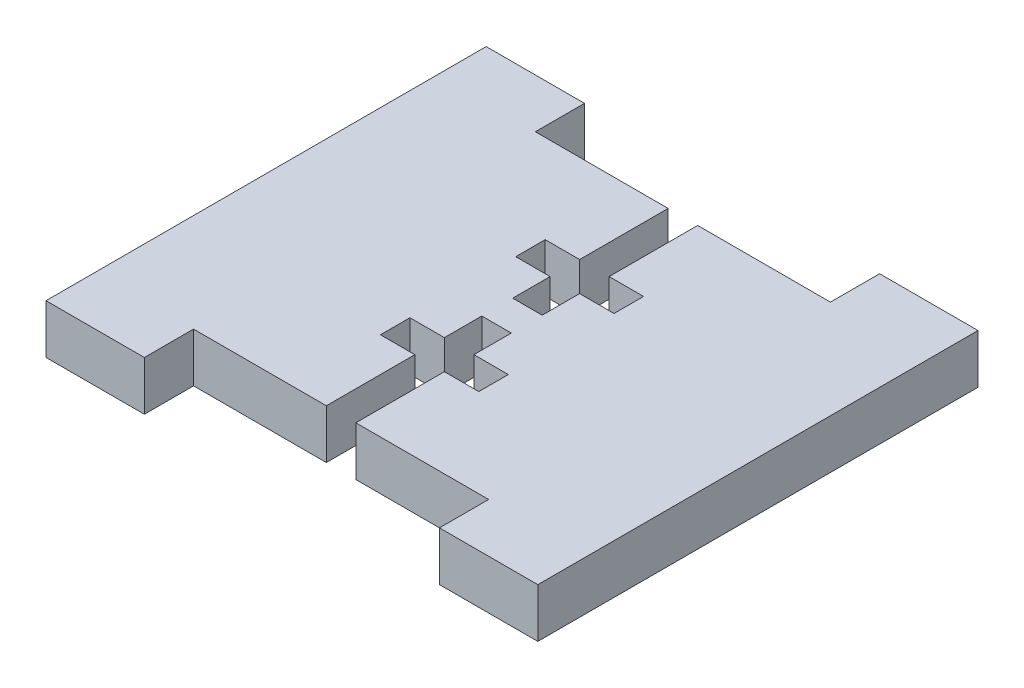
ISO-10303-21;
HEADER;
FILE_DESCRIPTION(('STEP AP214'),'2;1');
FILE_NAME('part.step','',(''),(''),'','','');
FILE_SCHEMA(('AUTOMOTIVE_DESIGN { 1 0 10303 214 1 1 1 1 }'));
ENDSEC;
DATA;
#1=APPLICATION_CONTEXT('core data for automotive mechanical design processes');
#2=APPLICATION_PROTOCOL_DEFINITION('international standard','automotive_design',2000,#1);
#3=PRODUCT_CONTEXT('',#1,'mechanical');
#4=PRODUCT('Part','Part','',(#3));
#5=PRODUCT_RELATED_PRODUCT_CATEGORY('part','',(#4));
#6=PRODUCT_DEFINITION_FORMATION('','',#4);
#7=PRODUCT_DEFINITION_CONTEXT('part definition',#1,'design');
#8=PRODUCT_DEFINITION('design','',#6,#7);
#9=PRODUCT_DEFINITION_SHAPE('','',#8);
#10=(LENGTH_UNIT() NAMED_UNIT(*) SI_UNIT(.MILLI.,.METRE.));
#11=(NAMED_UNIT(*) PLANE_ANGLE_UNIT() SI_UNIT($,.RADIAN.));
#12=(NAMED_UNIT(*) SI_UNIT($,.STERADIAN.) SOLID_ANGLE_UNIT());
#13=UNCERTAINTY_MEASURE_WITH_UNIT(LENGTH_MEASURE(1.E-05),#10,'distance_accuracy_value','');
#14=(GEOMETRIC_REPRESENTATION_CONTEXT(3) GLOBAL_UNCERTAINTY_ASSIGNED_CONTEXT((#13)) GLOBAL_UNIT_ASSIGNED_CONTEXT((#10,
#11,#12)) REPRESENTATION_CONTEXT('',''));
#15=CARTESIAN_POINT('',(0.,0.,0.));
#16=DIRECTION('',(0.,0.,1.));
#17=DIRECTION('',(1.,0.,0.));
#18=AXIS2_PLACEMENT_3D('',#15,#16,#17);
#19=CARTESIAN_POINT('',(0.,5.,0.));
#20=DIRECTION('',(1.,0.,0.));
#21=DIRECTION('',(0.,0.,-1.));
#22=AXIS2_PLACEMENT_3D('',#19,#20,#21);
#23=PLANE('',#22);
#24=DIRECTION('',(0.,0.,1.));
#25=VECTOR('',#24,1.);
#26=CARTESIAN_POINT('',(0.,0.,0.));
#27=LINE('',#26,#25);
#28=CARTESIAN_POINT('',(0.,0.,-44.75));
#29=VERTEX_POINT('',#28);
#30=CARTESIAN_POINT('',(0.,0.,0.));
#31=VERTEX_POINT('',#30);
#32=EDGE_CURVE('E298',#29,#31,#27,.T.);
#33=ORIENTED_EDGE('',*,*,#32,.T.);
#34=DIRECTION('',(0.,-1.,0.));
#35=VECTOR('',#34,1.);
#36=CARTESIAN_POINT('',(0.,5.,0.));
#37=LINE('',#36,#35);
#38=CARTESIAN_POINT('',(0.,5.,0.));
#39=VERTEX_POINT('',#38);
#40=EDGE_CURVE('E11',#39,#31,#37,.T.);
#41=ORIENTED_EDGE('',*,*,#40,.F.);
#42=DIRECTION('',(0.,0.,1.));
#43=VECTOR('',#42,1.);
#44=CARTESIAN_POINT('',(0.,5.,0.));
#45=LINE('',#44,#43);
#46=CARTESIAN_POINT('',(0.,5.,-44.75));
#47=VERTEX_POINT('',#46);
#48=EDGE_CURVE('E368',#47,#39,#45,.T.);
#49=ORIENTED_EDGE('',*,*,#48,.F.);
#50=DIRECTION('',(0.,-1.,0.));
#51=VECTOR('',#50,1.);
#52=CARTESIAN_POINT('',(0.,5.,-44.75));
#53=LINE('',#52,#51);
#54=EDGE_CURVE('E294',#47,#29,#53,.T.);
#55=ORIENTED_EDGE('',*,*,#54,.T.);
#56=EDGE_LOOP('',(#33,#41,#49,#55));
#57=FACE_BOUND('',#56,.T.);
#58=ADVANCED_FACE('F34',(#57),#23,.F.);
#59=CARTESIAN_POINT('',(0.,5.,0.));
#60=DIRECTION('',(0.,0.,-1.));
#61=DIRECTION('',(-1.,0.,0.));
#62=AXIS2_PLACEMENT_3D('',#59,#60,#61);
#63=PLANE('',#62);
#64=DIRECTION('',(1.,0.,0.));
#65=VECTOR('',#64,1.);
#66=CARTESIAN_POINT('',(0.,0.,0.));
#67=LINE('',#66,#65);
#68=CARTESIAN_POINT('',(10.,0.,0.));
#69=VERTEX_POINT('',#68);
#70=EDGE_CURVE('E301',#31,#69,#67,.T.);
#71=ORIENTED_EDGE('',*,*,#70,.T.);
#72=DIRECTION('',(0.,-1.,0.));
#73=VECTOR('',#72,1.);
#74=CARTESIAN_POINT('',(10.,5.,0.));
#75=LINE('',#74,#73);
#76=CARTESIAN_POINT('',(10.,5.,0.));
#77=VERTEX_POINT('',#76);
#78=EDGE_CURVE('E42',#77,#69,#75,.T.);
#79=ORIENTED_EDGE('',*,*,#78,.F.);
#80=DIRECTION('',(1.,0.,0.));
#81=VECTOR('',#80,1.);
#82=CARTESIAN_POINT('',(0.,5.,0.));
#83=LINE('',#82,#81);
#84=EDGE_CURVE('E177',#39,#77,#83,.T.);
#85=ORIENTED_EDGE('',*,*,#84,.F.);
#86=ORIENTED_EDGE('',*,*,#40,.T.);
#87=EDGE_LOOP('',(#71,#79,#85,#86));
#88=FACE_BOUND('',#87,.T.);
#89=ADVANCED_FACE('F566',(#88),#63,.F.);
#90=CARTESIAN_POINT('',(10.,5.,0.));
#91=DIRECTION('',(-1.,0.,0.));
#92=DIRECTION('',(0.,0.,1.));
#93=AXIS2_PLACEMENT_3D('',#90,#91,#92);
#94=PLANE('',#93);
#95=DIRECTION('',(0.,0.,-1.));
#96=VECTOR('',#95,1.);
#97=CARTESIAN_POINT('',(10.,0.,0.));
#98=LINE('',#97,#96);
#99=CARTESIAN_POINT('',(10.,0.,-5.));
#100=VERTEX_POINT('',#99);
#101=EDGE_CURVE('E303',#69,#100,#98,.T.);
#102=ORIENTED_EDGE('',*,*,#101,.T.);
#103=DIRECTION('',(0.,-1.,0.));
#104=VECTOR('',#103,1.);
#105=CARTESIAN_POINT('',(10.,5.,-5.));
#106=LINE('',#105,#104);
#107=CARTESIAN_POINT('',(10.,5.,-5.));
#108=VERTEX_POINT('',#107);
#109=EDGE_CURVE('E459',#108,#100,#106,.T.);
#110=ORIENTED_EDGE('',*,*,#109,.F.);
#111=DIRECTION('',(0.,0.,-1.));
#112=VECTOR('',#111,1.);
#113=CARTESIAN_POINT('',(10.,5.,0.));
#114=LINE('',#113,#112);
#115=EDGE_CURVE('E467',#77,#108,#114,.T.);
#116=ORIENTED_EDGE('',*,*,#115,.F.);
#117=ORIENTED_EDGE('',*,*,#78,.T.);
#118=EDGE_LOOP('',(#102,#110,#116,#117));
#119=FACE_BOUND('',#118,.T.);
#120=ADVANCED_FACE('F465',(#119),#94,.F.);
#121=CARTESIAN_POINT('',(10.,5.,-5.));
#122=DIRECTION('',(0.,0.,-1.));
#123=DIRECTION('',(-1.,0.,0.));
#124=AXIS2_PLACEMENT_3D('',#121,#122,#123);
#125=PLANE('',#124);
#126=DIRECTION('',(1.,0.,0.));
#127=VECTOR('',#126,1.);
#128=CARTESIAN_POINT('',(10.,0.,-5.));
#129=LINE('',#128,#127);
#130=CARTESIAN_POINT('',(23.5,0.,-5.));
#131=VERTEX_POINT('',#130);
#132=EDGE_CURVE('E305',#100,#131,#129,.T.);
#133=ORIENTED_EDGE('',*,*,#132,.T.);
#134=DIRECTION('',(0.,-1.,0.));
#135=VECTOR('',#134,1.);
#136=CARTESIAN_POINT('',(23.5,5.,-5.));
#137=LINE('',#136,#135);
#138=CARTESIAN_POINT('',(23.5,5.,-5.));
#139=VERTEX_POINT('',#138);
#140=EDGE_CURVE('E456',#139,#131,#137,.T.);
#141=ORIENTED_EDGE('',*,*,#140,.F.);
#142=DIRECTION('',(1.,0.,0.));
#143=VECTOR('',#142,1.);
#144=CARTESIAN_POINT('',(10.,5.,-5.));
#145=LINE('',#144,#143);
#146=EDGE_CURVE('E485',#108,#139,#145,.T.);
#147=ORIENTED_EDGE('',*,*,#146,.F.);
#148=ORIENTED_EDGE('',*,*,#109,.T.);
#149=EDGE_LOOP('',(#133,#141,#147,#148));
#150=FACE_BOUND('',#149,.T.);
#151=ADVANCED_FACE('F476',(#150),#125,.F.);
#152=CARTESIAN_POINT('',(23.5,5.,-5.));
#153=DIRECTION('',(-1.,0.,0.));
#154=DIRECTION('',(0.,0.,1.));
#155=AXIS2_PLACEMENT_3D('',#152,#153,#154);
#156=PLANE('',#155);
#157=DIRECTION('',(0.,0.,-1.));
#158=VECTOR('',#157,1.);
#159=CARTESIAN_POINT('',(23.5,0.,-5.));
#160=LINE('',#159,#158);
#161=CARTESIAN_POINT('',(23.5,0.,-14.));
#162=VERTEX_POINT('',#161);
#163=EDGE_CURVE('E307',#131,#162,#160,.T.);
#164=ORIENTED_EDGE('',*,*,#163,.T.);
#165=DIRECTION('',(0.,-1.,0.));
#166=VECTOR('',#165,1.);
#167=CARTESIAN_POINT('',(23.5,5.,-14.));
#168=LINE('',#167,#166);
#169=CARTESIAN_POINT('',(23.5,5.,-14.));
#170=VERTEX_POINT('',#169);
#171=EDGE_CURVE('E453',#170,#162,#168,.T.);
#172=ORIENTED_EDGE('',*,*,#171,.F.);
#173=DIRECTION('',(0.,0.,-1.));
#174=VECTOR('',#173,1.);
#175=CARTESIAN_POINT('',(23.5,5.,-5.));
#176=LINE('',#175,#174);
#177=EDGE_CURVE('E482',#139,#170,#176,.T.);
#178=ORIENTED_EDGE('',*,*,#177,.F.);
#179=ORIENTED_EDGE('',*,*,#140,.T.);
#180=EDGE_LOOP('',(#164,#172,#178,#179));
#181=FACE_BOUND('',#180,.T.);
#182=ADVANCED_FACE('F480',(#181),#156,.F.);
#183=CARTESIAN_POINT('',(23.5,5.,-14.));
#184=DIRECTION('',(0.,0.,1.));
#185=DIRECTION('',(1.,0.,0.));
#186=AXIS2_PLACEMENT_3D('',#183,#184,#185);
#187=PLANE('',#186);
#188=DIRECTION('',(-1.,0.,0.));
#189=VECTOR('',#188,1.);
#190=CARTESIAN_POINT('',(23.5,0.,-14.));
#191=LINE('',#190,#189);
#192=CARTESIAN_POINT('',(20.,0.,-14.));
#193=VERTEX_POINT('',#192);
#194=EDGE_CURVE('E309',#162,#193,#191,.T.);
#195=ORIENTED_EDGE('',*,*,#194,.T.);
#196=DIRECTION('',(0.,-1.,0.));
#197=VECTOR('',#196,1.);
#198=CARTESIAN_POINT('',(20.,5.,-14.));
#199=LINE('',#198,#197);
#200=CARTESIAN_POINT('',(20.,5.,-14.));
#201=VERTEX_POINT('',#200);
#202=EDGE_CURVE('E450',#201,#193,#199,.T.);
#203=ORIENTED_EDGE('',*,*,#202,.F.);
#204=DIRECTION('',(-1.,0.,0.));
#205=VECTOR('',#204,1.);
#206=CARTESIAN_POINT('',(23.5,5.,-14.));
#207=LINE('',#206,#205);
#208=EDGE_CURVE('E484',#170,#201,#207,.T.);
#209=ORIENTED_EDGE('',*,*,#208,.F.);
#210=ORIENTED_EDGE('',*,*,#171,.T.);
#211=EDGE_LOOP('',(#195,#203,#209,#210));
#212=FACE_BOUND('',#211,.T.);
#213=ADVANCED_FACE('F579',(#212),#187,.F.);
#214=CARTESIAN_POINT('',(20.,5.,-14.));
#215=DIRECTION('',(-1.,0.,0.));
#216=DIRECTION('',(0.,0.,1.));
#217=AXIS2_PLACEMENT_3D('',#214,#215,#216);
#218=PLANE('',#217);
#219=DIRECTION('',(0.,0.,-1.));
#220=VECTOR('',#219,1.);
#221=CARTESIAN_POINT('',(20.,0.,-14.));
#222=LINE('',#221,#220);
#223=CARTESIAN_POINT('',(20.,0.,-17.));
#224=VERTEX_POINT('',#223);
#225=EDGE_CURVE('E311',#193,#224,#222,.T.);
#226=ORIENTED_EDGE('',*,*,#225,.T.);
#227=DIRECTION('',(0.,-1.,0.));
#228=VECTOR('',#227,1.);
#229=CARTESIAN_POINT('',(20.,5.,-17.));
#230=LINE('',#229,#228);
#231=CARTESIAN_POINT('',(20.,5.,-17.));
#232=VERTEX_POINT('',#231);
#233=EDGE_CURVE('E447',#232,#224,#230,.T.);
#234=ORIENTED_EDGE('',*,*,#233,.F.);
#235=DIRECTION('',(0.,0.,-1.));
#236=VECTOR('',#235,1.);
#237=CARTESIAN_POINT('',(20.,5.,-14.));
#238=LINE('',#237,#236);
#239=EDGE_CURVE('E487',#201,#232,#238,.T.);
#240=ORIENTED_EDGE('',*,*,#239,.F.);
#241=ORIENTED_EDGE('',*,*,#202,.T.);
#242=EDGE_LOOP('',(#226,#234,#240,#241));
#243=FACE_BOUND('',#242,.T.);
#244=ADVANCED_FACE('F582',(#243),#218,.F.);
#245=CARTESIAN_POINT('',(20.,5.,-17.));
#246=DIRECTION('',(0.,0.,-1.));
#247=DIRECTION('',(-1.,0.,0.));
#248=AXIS2_PLACEMENT_3D('',#245,#246,#247);
#249=PLANE('',#248);
#250=DIRECTION('',(1.,0.,0.));
#251=VECTOR('',#250,1.);
#252=CARTESIAN_POINT('',(20.,0.,-17.));
#253=LINE('',#252,#251);
#254=CARTESIAN_POINT('',(23.5,0.,-17.));
#255=VERTEX_POINT('',#254);
#256=EDGE_CURVE('E313',#224,#255,#253,.T.);
#257=ORIENTED_EDGE('',*,*,#256,.T.);
#258=DIRECTION('',(0.,-1.,0.));
#259=VECTOR('',#258,1.);
#260=CARTESIAN_POINT('',(23.5,5.,-17.));
#261=LINE('',#260,#259);
#262=CARTESIAN_POINT('',(23.5,5.,-17.));
#263=VERTEX_POINT('',#262);
#264=EDGE_CURVE('E444',#263,#255,#261,.T.);
#265=ORIENTED_EDGE('',*,*,#264,.F.);
#266=DIRECTION('',(1.,0.,0.));
#267=VECTOR('',#266,1.);
#268=CARTESIAN_POINT('',(20.,5.,-17.));
#269=LINE('',#268,#267);
#270=EDGE_CURVE('E493',#232,#263,#269,.T.);
#271=ORIENTED_EDGE('',*,*,#270,.F.);
#272=ORIENTED_EDGE('',*,*,#233,.T.);
#273=EDGE_LOOP('',(#257,#265,#271,#272));
#274=FACE_BOUND('',#273,.T.);
#275=ADVANCED_FACE('F586',(#274),#249,.F.);
#276=CARTESIAN_POINT('',(23.5,5.,-17.));
#277=DIRECTION('',(-1.,0.,0.));
#278=DIRECTION('',(0.,0.,1.));
#279=AXIS2_PLACEMENT_3D('',#276,#277,#278);
#280=PLANE('',#279);
#281=DIRECTION('',(0.,0.,-1.));
#282=VECTOR('',#281,1.);
#283=CARTESIAN_POINT('',(23.5,0.,-17.));
#284=LINE('',#283,#282);
#285=CARTESIAN_POINT('',(23.5,0.,-20.8038524999422));
#286=VERTEX_POINT('',#285);
#287=EDGE_CURVE('E315',#255,#286,#284,.T.);
#288=ORIENTED_EDGE('',*,*,#287,.T.);
#289=DIRECTION('',(0.,-1.,0.));
#290=VECTOR('',#289,1.);
#291=CARTESIAN_POINT('',(23.5,5.,-20.8038524999422));
#292=LINE('',#291,#290);
#293=CARTESIAN_POINT('',(23.5,5.,-20.8038524999422));
#294=VERTEX_POINT('',#293);
#295=EDGE_CURVE('E441',#294,#286,#292,.T.);
#296=ORIENTED_EDGE('',*,*,#295,.F.);
#297=DIRECTION('',(0.,0.,-1.));
#298=VECTOR('',#297,1.);
#299=CARTESIAN_POINT('',(23.5,5.,-17.));
#300=LINE('',#299,#298);
#301=EDGE_CURVE('E495',#263,#294,#300,.T.);
#302=ORIENTED_EDGE('',*,*,#301,.F.);
#303=ORIENTED_EDGE('',*,*,#264,.T.);
#304=EDGE_LOOP('',(#288,#296,#302,#303));
#305=FACE_BOUND('',#304,.T.);
#306=ADVANCED_FACE('F590',(#305),#280,.F.);
#307=CARTESIAN_POINT('',(23.5,5.,-20.8038524999422));
#308=DIRECTION('',(0.,0.,-1.));
#309=DIRECTION('',(-1.,0.,0.));
#310=AXIS2_PLACEMENT_3D('',#307,#308,#309);
#311=PLANE('',#310);
#312=DIRECTION('',(1.,0.,0.));
#313=VECTOR('',#312,1.);
#314=CARTESIAN_POINT('',(23.5,0.,-20.8038524999422));
#315=LINE('',#314,#313);
#316=CARTESIAN_POINT('',(26.5,0.,-20.8038524999422));
#317=VERTEX_POINT('',#316);
#318=EDGE_CURVE('E317',#286,#317,#315,.T.);
#319=ORIENTED_EDGE('',*,*,#318,.T.);
#320=DIRECTION('',(0.,-1.,0.));
#321=VECTOR('',#320,1.);
#322=CARTESIAN_POINT('',(26.5,5.,-20.8038524999422));
#323=LINE('',#322,#321);
#324=CARTESIAN_POINT('',(26.5,5.,-20.8038524999422));
#325=VERTEX_POINT('',#324);
#326=EDGE_CURVE('E438',#325,#317,#323,.T.);
#327=ORIENTED_EDGE('',*,*,#326,.F.);
#328=DIRECTION('',(1.,0.,0.));
#329=VECTOR('',#328,1.);
#330=CARTESIAN_POINT('',(23.5,5.,-20.8038524999422));
#331=LINE('',#330,#329);
#332=EDGE_CURVE('E497',#294,#325,#331,.T.);
#333=ORIENTED_EDGE('',*,*,#332,.F.);
#334=ORIENTED_EDGE('',*,*,#295,.T.);
#335=EDGE_LOOP('',(#319,#327,#333,#334));
#336=FACE_BOUND('',#335,.T.);
#337=ADVANCED_FACE('F594',(#336),#311,.F.);
#338=CARTESIAN_POINT('',(26.5,5.,-17.));
#339=DIRECTION('',(1.,0.,0.));
#340=DIRECTION('',(0.,0.,-1.));
#341=AXIS2_PLACEMENT_3D('',#338,#339,#340);
#342=PLANE('',#341);
#343=DIRECTION('',(0.,0.,1.));
#344=VECTOR('',#343,1.);
#345=CARTESIAN_POINT('',(26.5,0.,-17.));
#346=LINE('',#345,#344);
#347=CARTESIAN_POINT('',(26.5,0.,-17.));
#348=VERTEX_POINT('',#347);
#349=EDGE_CURVE('E319',#317,#348,#346,.T.);
#350=ORIENTED_EDGE('',*,*,#349,.T.);
#351=DIRECTION('',(0.,-1.,0.));
#352=VECTOR('',#351,1.);
#353=CARTESIAN_POINT('',(26.5,5.,-17.));
#354=LINE('',#353,#352);
#355=CARTESIAN_POINT('',(26.5,5.,-17.));
#356=VERTEX_POINT('',#355);
#357=EDGE_CURVE('E435',#356,#348,#354,.T.);
#358=ORIENTED_EDGE('',*,*,#357,.F.);
#359=DIRECTION('',(0.,0.,1.));
#360=VECTOR('',#359,1.);
#361=CARTESIAN_POINT('',(26.5,5.,-17.));
#362=LINE('',#361,#360);
#363=EDGE_CURVE('E499',#325,#356,#362,.T.);
#364=ORIENTED_EDGE('',*,*,#363,.F.);
#365=ORIENTED_EDGE('',*,*,#326,.T.);
#366=EDGE_LOOP('',(#350,#358,#364,#365));
#367=FACE_BOUND('',#366,.T.);
#368=ADVANCED_FACE('F598',(#367),#342,.F.);
#369=CARTESIAN_POINT('',(30.,5.,-17.));
#370=DIRECTION('',(0.,0.,-1.));
#371=DIRECTION('',(-1.,0.,0.));
#372=AXIS2_PLACEMENT_3D('',#369,#370,#371);
#373=PLANE('',#372);
#374=DIRECTION('',(1.,0.,0.));
#375=VECTOR('',#374,1.);
#376=CARTESIAN_POINT('',(30.,0.,-17.));
#377=LINE('',#376,#375);
#378=CARTESIAN_POINT('',(30.,0.,-17.));
#379=VERTEX_POINT('',#378);
#380=EDGE_CURVE('E321',#348,#379,#377,.T.);
#381=ORIENTED_EDGE('',*,*,#380,.T.);
#382=DIRECTION('',(0.,-1.,0.));
#383=VECTOR('',#382,1.);
#384=CARTESIAN_POINT('',(30.,5.,-17.));
#385=LINE('',#384,#383);
#386=CARTESIAN_POINT('',(30.,5.,-17.));
#387=VERTEX_POINT('',#386);
#388=EDGE_CURVE('E432',#387,#379,#385,.T.);
#389=ORIENTED_EDGE('',*,*,#388,.F.);
#390=DIRECTION('',(1.,0.,0.));
#391=VECTOR('',#390,1.);
#392=CARTESIAN_POINT('',(30.,5.,-17.));
#393=LINE('',#392,#391);
#394=EDGE_CURVE('E501',#356,#387,#393,.T.);
#395=ORIENTED_EDGE('',*,*,#394,.F.);
#396=ORIENTED_EDGE('',*,*,#357,.T.);
#397=EDGE_LOOP('',(#381,#389,#395,#396));
#398=FACE_BOUND('',#397,.T.);
#399=ADVANCED_FACE('F602',(#398),#373,.F.);
#400=CARTESIAN_POINT('',(30.,5.,-14.));
#401=DIRECTION('',(1.,0.,0.));
#402=DIRECTION('',(0.,0.,-1.));
#403=AXIS2_PLACEMENT_3D('',#400,#401,#402);
#404=PLANE('',#403);
#405=DIRECTION('',(0.,0.,1.));
#406=VECTOR('',#405,1.);
#407=CARTESIAN_POINT('',(30.,0.,-14.));
#408=LINE('',#407,#406);
#409=CARTESIAN_POINT('',(30.,0.,-14.));
#410=VERTEX_POINT('',#409);
#411=EDGE_CURVE('E323',#379,#410,#408,.T.);
#412=ORIENTED_EDGE('',*,*,#411,.T.);
#413=DIRECTION('',(0.,-1.,0.));
#414=VECTOR('',#413,1.);
#415=CARTESIAN_POINT('',(30.,5.,-14.));
#416=LINE('',#415,#414);
#417=CARTESIAN_POINT('',(30.,5.,-14.));
#418=VERTEX_POINT('',#417);
#419=EDGE_CURVE('E429',#418,#410,#416,.T.);
#420=ORIENTED_EDGE('',*,*,#419,.F.);
#421=DIRECTION('',(0.,0.,1.));
#422=VECTOR('',#421,1.);
#423=CARTESIAN_POINT('',(30.,5.,-14.));
#424=LINE('',#423,#422);
#425=EDGE_CURVE('E503',#387,#418,#424,.T.);
#426=ORIENTED_EDGE('',*,*,#425,.F.);
#427=ORIENTED_EDGE('',*,*,#388,.T.);
#428=EDGE_LOOP('',(#412,#420,#426,#427));
#429=FACE_BOUND('',#428,.T.);
#430=ADVANCED_FACE('F606',(#429),#404,.F.);
#431=CARTESIAN_POINT('',(26.5,5.,-14.));
#432=DIRECTION('',(0.,0.,1.));
#433=DIRECTION('',(1.,0.,0.));
#434=AXIS2_PLACEMENT_3D('',#431,#432,#433);
#435=PLANE('',#434);
#436=DIRECTION('',(-1.,0.,0.));
#437=VECTOR('',#436,1.);
#438=CARTESIAN_POINT('',(26.5,0.,-14.));
#439=LINE('',#438,#437);
#440=CARTESIAN_POINT('',(26.5,0.,-14.));
#441=VERTEX_POINT('',#440);
#442=EDGE_CURVE('E325',#410,#441,#439,.T.);
#443=ORIENTED_EDGE('',*,*,#442,.T.);
#444=DIRECTION('',(0.,-1.,0.));
#445=VECTOR('',#444,1.);
#446=CARTESIAN_POINT('',(26.5,5.,-14.));
#447=LINE('',#446,#445);
#448=CARTESIAN_POINT('',(26.5,5.,-14.));
#449=VERTEX_POINT('',#448);
#450=EDGE_CURVE('E426',#449,#441,#447,.T.);
#451=ORIENTED_EDGE('',*,*,#450,.F.);
#452=DIRECTION('',(-1.,0.,0.));
#453=VECTOR('',#452,1.);
#454=CARTESIAN_POINT('',(26.5,5.,-14.));
#455=LINE('',#454,#453);
#456=EDGE_CURVE('E505',#418,#449,#455,.T.);
#457=ORIENTED_EDGE('',*,*,#456,.F.);
#458=ORIENTED_EDGE('',*,*,#419,.T.);
#459=EDGE_LOOP('',(#443,#451,#457,#458));
#460=FACE_BOUND('',#459,.T.);
#461=ADVANCED_FACE('F610',(#460),#435,.F.);
#462=CARTESIAN_POINT('',(26.5,5.,-5.));
#463=DIRECTION('',(1.,0.,0.));
#464=DIRECTION('',(0.,0.,-1.));
#465=AXIS2_PLACEMENT_3D('',#462,#463,#464);
#466=PLANE('',#465);
#467=DIRECTION('',(0.,0.,1.));
#468=VECTOR('',#467,1.);
#469=CARTESIAN_POINT('',(26.5,0.,-5.));
#470=LINE('',#469,#468);
#471=CARTESIAN_POINT('',(26.5,0.,-5.));
#472=VERTEX_POINT('',#471);
#473=EDGE_CURVE('E327',#441,#472,#470,.T.);
#474=ORIENTED_EDGE('',*,*,#473,.T.);
#475=DIRECTION('',(0.,-1.,0.));
#476=VECTOR('',#475,1.);
#477=CARTESIAN_POINT('',(26.5,5.,-5.));
#478=LINE('',#477,#476);
#479=CARTESIAN_POINT('',(26.5,5.,-5.));
#480=VERTEX_POINT('',#479);
#481=EDGE_CURVE('E423',#480,#472,#478,.T.);
#482=ORIENTED_EDGE('',*,*,#481,.F.);
#483=DIRECTION('',(0.,0.,1.));
#484=VECTOR('',#483,1.);
#485=CARTESIAN_POINT('',(26.5,5.,-5.));
#486=LINE('',#485,#484);
#487=EDGE_CURVE('E507',#449,#480,#486,.T.);
#488=ORIENTED_EDGE('',*,*,#487,.F.);
#489=ORIENTED_EDGE('',*,*,#450,.T.);
#490=EDGE_LOOP('',(#474,#482,#488,#489));
#491=FACE_BOUND('',#490,.T.);
#492=ADVANCED_FACE('F614',(#491),#466,.F.);
#493=CARTESIAN_POINT('',(40.,5.,-5.));
#494=DIRECTION('',(0.,0.,-1.));
#495=DIRECTION('',(-1.,0.,0.));
#496=AXIS2_PLACEMENT_3D('',#493,#494,#495);
#497=PLANE('',#496);
#498=DIRECTION('',(1.,0.,0.));
#499=VECTOR('',#498,1.);
#500=CARTESIAN_POINT('',(40.,0.,-5.));
#501=LINE('',#500,#499);
#502=CARTESIAN_POINT('',(40.,0.,-5.));
#503=VERTEX_POINT('',#502);
#504=EDGE_CURVE('E329',#472,#503,#501,.T.);
#505=ORIENTED_EDGE('',*,*,#504,.T.);
#506=DIRECTION('',(0.,-1.,0.));
#507=VECTOR('',#506,1.);
#508=CARTESIAN_POINT('',(40.,5.,-5.));
#509=LINE('',#508,#507);
#510=CARTESIAN_POINT('',(40.,5.,-5.));
#511=VERTEX_POINT('',#510);
#512=EDGE_CURVE('E420',#511,#503,#509,.T.);
#513=ORIENTED_EDGE('',*,*,#512,.F.);
#514=DIRECTION('',(1.,0.,0.));
#515=VECTOR('',#514,1.);
#516=CARTESIAN_POINT('',(40.,5.,-5.));
#517=LINE('',#516,#515);
#518=EDGE_CURVE('E509',#480,#511,#517,.T.);
#519=ORIENTED_EDGE('',*,*,#518,.F.);
#520=ORIENTED_EDGE('',*,*,#481,.T.);
#521=EDGE_LOOP('',(#505,#513,#519,#520));
#522=FACE_BOUND('',#521,.T.);
#523=ADVANCED_FACE('F618',(#522),#497,.F.);
#524=CARTESIAN_POINT('',(40.,5.,0.));
#525=DIRECTION('',(1.,0.,0.));
#526=DIRECTION('',(0.,0.,-1.));
#527=AXIS2_PLACEMENT_3D('',#524,#525,#526);
#528=PLANE('',#527);
#529=DIRECTION('',(0.,0.,1.));
#530=VECTOR('',#529,1.);
#531=CARTESIAN_POINT('',(40.,0.,0.));
#532=LINE('',#531,#530);
#533=CARTESIAN_POINT('',(40.,0.,0.));
#534=VERTEX_POINT('',#533);
#535=EDGE_CURVE('E331',#503,#534,#532,.T.);
#536=ORIENTED_EDGE('',*,*,#535,.T.);
#537=DIRECTION('',(0.,-1.,0.));
#538=VECTOR('',#537,1.);
#539=CARTESIAN_POINT('',(40.,5.,0.));
#540=LINE('',#539,#538);
#541=CARTESIAN_POINT('',(40.,5.,0.));
#542=VERTEX_POINT('',#541);
#543=EDGE_CURVE('E417',#542,#534,#540,.T.);
#544=ORIENTED_EDGE('',*,*,#543,.F.);
#545=DIRECTION('',(0.,0.,1.));
#546=VECTOR('',#545,1.);
#547=CARTESIAN_POINT('',(40.,5.,0.));
#548=LINE('',#547,#546);
#549=EDGE_CURVE('E511',#511,#542,#548,.T.);
#550=ORIENTED_EDGE('',*,*,#549,.F.);
#551=ORIENTED_EDGE('',*,*,#512,.T.);
#552=EDGE_LOOP('',(#536,#544,#550,#551));
#553=FACE_BOUND('',#552,.T.);
#554=ADVANCED_FACE('F622',(#553),#528,.F.);
#555=CARTESIAN_POINT('',(50.,5.,0.));
#556=DIRECTION('',(0.,0.,-1.));
#557=DIRECTION('',(-1.,0.,0.));
#558=AXIS2_PLACEMENT_3D('',#555,#556,#557);
#559=PLANE('',#558);
#560=DIRECTION('',(1.,0.,0.));
#561=VECTOR('',#560,1.);
#562=CARTESIAN_POINT('',(50.,0.,0.));
#563=LINE('',#562,#561);
#564=CARTESIAN_POINT('',(50.,0.,0.));
#565=VERTEX_POINT('',#564);
#566=EDGE_CURVE('E333',#534,#565,#563,.T.);
#567=ORIENTED_EDGE('',*,*,#566,.T.);
#568=DIRECTION('',(0.,-1.,0.));
#569=VECTOR('',#568,1.);
#570=CARTESIAN_POINT('',(50.,5.,0.));
#571=LINE('',#570,#569);
#572=CARTESIAN_POINT('',(50.,5.,0.));
#573=VERTEX_POINT('',#572);
#574=EDGE_CURVE('E414',#573,#565,#571,.T.);
#575=ORIENTED_EDGE('',*,*,#574,.F.);
#576=DIRECTION('',(1.,0.,0.));
#577=VECTOR('',#576,1.);
#578=CARTESIAN_POINT('',(50.,5.,0.));
#579=LINE('',#578,#577);
#580=EDGE_CURVE('E513',#542,#573,#579,.T.);
#581=ORIENTED_EDGE('',*,*,#580,.F.);
#582=ORIENTED_EDGE('',*,*,#543,.T.);
#583=EDGE_LOOP('',(#567,#575,#581,#582));
#584=FACE_BOUND('',#583,.T.);
#585=ADVANCED_FACE('F626',(#584),#559,.F.);
#586=CARTESIAN_POINT('',(50.,5.,0.));
#587=DIRECTION('',(-1.,0.,0.));
#588=DIRECTION('',(0.,0.,1.));
#589=AXIS2_PLACEMENT_3D('',#586,#587,#588);
#590=PLANE('',#589);
#591=DIRECTION('',(0.,0.,-1.));
#592=VECTOR('',#591,1.);
#593=CARTESIAN_POINT('',(50.,0.,0.));
#594=LINE('',#593,#592);
#595=CARTESIAN_POINT('',(50.,0.,-44.75));
#596=VERTEX_POINT('',#595);
#597=EDGE_CURVE('E335',#565,#596,#594,.T.);
#598=ORIENTED_EDGE('',*,*,#597,.T.);
#599=DIRECTION('',(0.,-1.,0.));
#600=VECTOR('',#599,1.);
#601=CARTESIAN_POINT('',(50.,5.,-44.75));
#602=LINE('',#601,#600);
#603=CARTESIAN_POINT('',(50.,5.,-44.75));
#604=VERTEX_POINT('',#603);
#605=EDGE_CURVE('E411',#604,#596,#602,.T.);
#606=ORIENTED_EDGE('',*,*,#605,.F.);
#607=DIRECTION('',(0.,0.,-1.));
#608=VECTOR('',#607,1.);
#609=CARTESIAN_POINT('',(50.,5.,0.));
#610=LINE('',#609,#608);
#611=EDGE_CURVE('E515',#573,#604,#610,.T.);
#612=ORIENTED_EDGE('',*,*,#611,.F.);
#613=ORIENTED_EDGE('',*,*,#574,.T.);
#614=EDGE_LOOP('',(#598,#606,#612,#613));
#615=FACE_BOUND('',#614,.T.);
#616=ADVANCED_FACE('F630',(#615),#590,.F.);
#617=CARTESIAN_POINT('',(50.,5.,-44.75));
#618=DIRECTION('',(0.,0.,1.));
#619=DIRECTION('',(1.,0.,0.));
#620=AXIS2_PLACEMENT_3D('',#617,#618,#619);
#621=PLANE('',#620);
#622=DIRECTION('',(-1.,0.,0.));
#623=VECTOR('',#622,1.);
#624=CARTESIAN_POINT('',(50.,0.,-44.75));
#625=LINE('',#624,#623);
#626=CARTESIAN_POINT('',(40.,0.,-44.75));
#627=VERTEX_POINT('',#626);
#628=EDGE_CURVE('E337',#596,#627,#625,.T.);
#629=ORIENTED_EDGE('',*,*,#628,.T.);
#630=DIRECTION('',(0.,-1.,0.));
#631=VECTOR('',#630,1.);
#632=CARTESIAN_POINT('',(40.,5.,-44.75));
#633=LINE('',#632,#631);
#634=CARTESIAN_POINT('',(40.,5.,-44.75));
#635=VERTEX_POINT('',#634);
#636=EDGE_CURVE('E408',#635,#627,#633,.T.);
#637=ORIENTED_EDGE('',*,*,#636,.F.);
#638=DIRECTION('',(-1.,0.,0.));
#639=VECTOR('',#638,1.);
#640=CARTESIAN_POINT('',(50.,5.,-44.75));
#641=LINE('',#640,#639);
#642=EDGE_CURVE('E517',#604,#635,#641,.T.);
#643=ORIENTED_EDGE('',*,*,#642,.F.);
#644=ORIENTED_EDGE('',*,*,#605,.T.);
#645=EDGE_LOOP('',(#629,#637,#643,#644));
#646=FACE_BOUND('',#645,.T.);
#647=ADVANCED_FACE('F634',(#646),#621,.F.);
#648=CARTESIAN_POINT('',(40.,5.,-44.75));
#649=DIRECTION('',(1.,0.,0.));
#650=DIRECTION('',(0.,0.,-1.));
#651=AXIS2_PLACEMENT_3D('',#648,#649,#650);
#652=PLANE('',#651);
#653=DIRECTION('',(0.,0.,1.));
#654=VECTOR('',#653,1.);
#655=CARTESIAN_POINT('',(40.,0.,-44.75));
#656=LINE('',#655,#654);
#657=CARTESIAN_POINT('',(40.,0.,-39.75));
#658=VERTEX_POINT('',#657);
#659=EDGE_CURVE('E339',#627,#658,#656,.T.);
#660=ORIENTED_EDGE('',*,*,#659,.T.);
#661=DIRECTION('',(0.,-1.,0.));
#662=VECTOR('',#661,1.);
#663=CARTESIAN_POINT('',(40.,5.,-39.75));
#664=LINE('',#663,#662);
#665=CARTESIAN_POINT('',(40.,5.,-39.75));
#666=VERTEX_POINT('',#665);
#667=EDGE_CURVE('E405',#666,#658,#664,.T.);
#668=ORIENTED_EDGE('',*,*,#667,.F.);
#669=DIRECTION('',(0.,0.,1.));
#670=VECTOR('',#669,1.);
#671=CARTESIAN_POINT('',(40.,5.,-44.75));
#672=LINE('',#671,#670);
#673=EDGE_CURVE('E519',#635,#666,#672,.T.);
#674=ORIENTED_EDGE('',*,*,#673,.F.);
#675=ORIENTED_EDGE('',*,*,#636,.T.);
#676=EDGE_LOOP('',(#660,#668,#674,#675));
#677=FACE_BOUND('',#676,.T.);
#678=ADVANCED_FACE('F638',(#677),#652,.F.);
#679=CARTESIAN_POINT('',(40.,5.,-39.75));
#680=DIRECTION('',(0.,0.,1.));
#681=DIRECTION('',(1.,0.,0.));
#682=AXIS2_PLACEMENT_3D('',#679,#680,#681);
#683=PLANE('',#682);
#684=DIRECTION('',(-1.,0.,0.));
#685=VECTOR('',#684,1.);
#686=CARTESIAN_POINT('',(40.,0.,-39.75));
#687=LINE('',#686,#685);
#688=CARTESIAN_POINT('',(26.5,0.,-39.75));
#689=VERTEX_POINT('',#688);
#690=EDGE_CURVE('E341',#658,#689,#687,.T.);
#691=ORIENTED_EDGE('',*,*,#690,.T.);
#692=DIRECTION('',(0.,-1.,0.));
#693=VECTOR('',#692,1.);
#694=CARTESIAN_POINT('',(26.5,5.,-39.75));
#695=LINE('',#694,#693);
#696=CARTESIAN_POINT('',(26.5,5.,-39.75));
#697=VERTEX_POINT('',#696);
#698=EDGE_CURVE('E402',#697,#689,#695,.T.);
#699=ORIENTED_EDGE('',*,*,#698,.F.);
#700=DIRECTION('',(-1.,0.,0.));
#701=VECTOR('',#700,1.);
#702=CARTESIAN_POINT('',(40.,5.,-39.75));
#703=LINE('',#702,#701);
#704=EDGE_CURVE('E521',#666,#697,#703,.T.);
#705=ORIENTED_EDGE('',*,*,#704,.F.);
#706=ORIENTED_EDGE('',*,*,#667,.T.);
#707=EDGE_LOOP('',(#691,#699,#705,#706));
#708=FACE_BOUND('',#707,.T.);
#709=ADVANCED_FACE('F642',(#708),#683,.F.);
#710=CARTESIAN_POINT('',(26.5,5.,-39.75));
#711=DIRECTION('',(1.,0.,0.));
#712=DIRECTION('',(0.,0.,-1.));
#713=AXIS2_PLACEMENT_3D('',#710,#711,#712);
#714=PLANE('',#713);
#715=DIRECTION('',(0.,0.,1.));
#716=VECTOR('',#715,1.);
#717=CARTESIAN_POINT('',(26.5,0.,-39.75));
#718=LINE('',#717,#716);
#719=CARTESIAN_POINT('',(26.5,0.,-30.75));
#720=VERTEX_POINT('',#719);
#721=EDGE_CURVE('E343',#689,#720,#718,.T.);
#722=ORIENTED_EDGE('',*,*,#721,.T.);
#723=DIRECTION('',(0.,-1.,0.));
#724=VECTOR('',#723,1.);
#725=CARTESIAN_POINT('',(26.5,5.,-30.75));
#726=LINE('',#725,#724);
#727=CARTESIAN_POINT('',(26.5,5.,-30.75));
#728=VERTEX_POINT('',#727);
#729=EDGE_CURVE('E399',#728,#720,#726,.T.);
#730=ORIENTED_EDGE('',*,*,#729,.F.);
#731=DIRECTION('',(0.,0.,1.));
#732=VECTOR('',#731,1.);
#733=CARTESIAN_POINT('',(26.5,5.,-39.75));
#734=LINE('',#733,#732);
#735=EDGE_CURVE('E523',#697,#728,#734,.T.);
#736=ORIENTED_EDGE('',*,*,#735,.F.);
#737=ORIENTED_EDGE('',*,*,#698,.T.);
#738=EDGE_LOOP('',(#722,#730,#736,#737));
#739=FACE_BOUND('',#738,.T.);
#740=ADVANCED_FACE('F646',(#739),#714,.F.);
#741=CARTESIAN_POINT('',(26.5,5.,-30.75));
#742=DIRECTION('',(0.,0.,-1.));
#743=DIRECTION('',(-1.,0.,0.));
#744=AXIS2_PLACEMENT_3D('',#741,#742,#743);
#745=PLANE('',#744);
#746=DIRECTION('',(1.,0.,0.));
#747=VECTOR('',#746,1.);
#748=CARTESIAN_POINT('',(26.5,0.,-30.75));
#749=LINE('',#748,#747);
#750=CARTESIAN_POINT('',(30.,0.,-30.75));
#751=VERTEX_POINT('',#750);
#752=EDGE_CURVE('E345',#720,#751,#749,.T.);
#753=ORIENTED_EDGE('',*,*,#752,.T.);
#754=DIRECTION('',(0.,-1.,0.));
#755=VECTOR('',#754,1.);
#756=CARTESIAN_POINT('',(30.,5.,-30.75));
#757=LINE('',#756,#755);
#758=CARTESIAN_POINT('',(30.,5.,-30.75));
#759=VERTEX_POINT('',#758);
#760=EDGE_CURVE('E396',#759,#751,#757,.T.);
#761=ORIENTED_EDGE('',*,*,#760,.F.);
#762=DIRECTION('',(1.,0.,0.));
#763=VECTOR('',#762,1.);
#764=CARTESIAN_POINT('',(26.5,5.,-30.75));
#765=LINE('',#764,#763);
#766=EDGE_CURVE('E525',#728,#759,#765,.T.);
#767=ORIENTED_EDGE('',*,*,#766,.F.);
#768=ORIENTED_EDGE('',*,*,#729,.T.);
#769=EDGE_LOOP('',(#753,#761,#767,#768));
#770=FACE_BOUND('',#769,.T.);
#771=ADVANCED_FACE('F650',(#770),#745,.F.);
#772=CARTESIAN_POINT('',(30.,5.,-30.75));
#773=DIRECTION('',(1.,0.,0.));
#774=DIRECTION('',(0.,0.,-1.));
#775=AXIS2_PLACEMENT_3D('',#772,#773,#774);
#776=PLANE('',#775);
#777=DIRECTION('',(0.,0.,1.));
#778=VECTOR('',#777,1.);
#779=CARTESIAN_POINT('',(30.,0.,-30.75));
#780=LINE('',#779,#778);
#781=CARTESIAN_POINT('',(30.,0.,-27.75));
#782=VERTEX_POINT('',#781);
#783=EDGE_CURVE('E347',#751,#782,#780,.T.);
#784=ORIENTED_EDGE('',*,*,#783,.T.);
#785=DIRECTION('',(0.,-1.,0.));
#786=VECTOR('',#785,1.);
#787=CARTESIAN_POINT('',(30.,5.,-27.75));
#788=LINE('',#787,#786);
#789=CARTESIAN_POINT('',(30.,5.,-27.75));
#790=VERTEX_POINT('',#789);
#791=EDGE_CURVE('E393',#790,#782,#788,.T.);
#792=ORIENTED_EDGE('',*,*,#791,.F.);
#793=DIRECTION('',(0.,0.,1.));
#794=VECTOR('',#793,1.);
#795=CARTESIAN_POINT('',(30.,5.,-30.75));
#796=LINE('',#795,#794);
#797=EDGE_CURVE('E527',#759,#790,#796,.T.);
#798=ORIENTED_EDGE('',*,*,#797,.F.);
#799=ORIENTED_EDGE('',*,*,#760,.T.);
#800=EDGE_LOOP('',(#784,#792,#798,#799));
#801=FACE_BOUND('',#800,.T.);
#802=ADVANCED_FACE('F654',(#801),#776,.F.);
#803=CARTESIAN_POINT('',(30.,5.,-27.75));
#804=DIRECTION('',(0.,0.,1.));
#805=DIRECTION('',(1.,0.,0.));
#806=AXIS2_PLACEMENT_3D('',#803,#804,#805);
#807=PLANE('',#806);
#808=DIRECTION('',(-1.,0.,0.));
#809=VECTOR('',#808,1.);
#810=CARTESIAN_POINT('',(30.,0.,-27.75));
#811=LINE('',#810,#809);
#812=CARTESIAN_POINT('',(26.5,0.,-27.75));
#813=VERTEX_POINT('',#812);
#814=EDGE_CURVE('E349',#782,#813,#811,.T.);
#815=ORIENTED_EDGE('',*,*,#814,.T.);
#816=DIRECTION('',(0.,-1.,0.));
#817=VECTOR('',#816,1.);
#818=CARTESIAN_POINT('',(26.5,5.,-27.75));
#819=LINE('',#818,#817);
#820=CARTESIAN_POINT('',(26.5,5.,-27.75));
#821=VERTEX_POINT('',#820);
#822=EDGE_CURVE('E390',#821,#813,#819,.T.);
#823=ORIENTED_EDGE('',*,*,#822,.F.);
#824=DIRECTION('',(-1.,0.,0.));
#825=VECTOR('',#824,1.);
#826=CARTESIAN_POINT('',(30.,5.,-27.75));
#827=LINE('',#826,#825);
#828=EDGE_CURVE('E529',#790,#821,#827,.T.);
#829=ORIENTED_EDGE('',*,*,#828,.F.);
#830=ORIENTED_EDGE('',*,*,#791,.T.);
#831=EDGE_LOOP('',(#815,#823,#829,#830));
#832=FACE_BOUND('',#831,.T.);
#833=ADVANCED_FACE('F658',(#832),#807,.F.);
#834=CARTESIAN_POINT('',(26.5,5.,-27.75));
#835=DIRECTION('',(1.,0.,0.));
#836=DIRECTION('',(0.,0.,-1.));
#837=AXIS2_PLACEMENT_3D('',#834,#835,#836);
#838=PLANE('',#837);
#839=DIRECTION('',(0.,0.,1.));
#840=VECTOR('',#839,1.);
#841=CARTESIAN_POINT('',(26.5,0.,-27.75));
#842=LINE('',#841,#840);
#843=CARTESIAN_POINT('',(26.5,0.,-23.9461475000577));
#844=VERTEX_POINT('',#843);
#845=EDGE_CURVE('E351',#813,#844,#842,.T.);
#846=ORIENTED_EDGE('',*,*,#845,.T.);
#847=DIRECTION('',(0.,-1.,0.));
#848=VECTOR('',#847,1.);
#849=CARTESIAN_POINT('',(26.5,5.,-23.9461475000577));
#850=LINE('',#849,#848);
#851=CARTESIAN_POINT('',(26.5,5.,-23.9461475000577));
#852=VERTEX_POINT('',#851);
#853=EDGE_CURVE('E387',#852,#844,#850,.T.);
#854=ORIENTED_EDGE('',*,*,#853,.F.);
#855=DIRECTION('',(0.,0.,1.));
#856=VECTOR('',#855,1.);
#857=CARTESIAN_POINT('',(26.5,5.,-27.75));
#858=LINE('',#857,#856);
#859=EDGE_CURVE('E531',#821,#852,#858,.T.);
#860=ORIENTED_EDGE('',*,*,#859,.F.);
#861=ORIENTED_EDGE('',*,*,#822,.T.);
#862=EDGE_LOOP('',(#846,#854,#860,#861));
#863=FACE_BOUND('',#862,.T.);
#864=ADVANCED_FACE('F662',(#863),#838,.F.);
#865=CARTESIAN_POINT('',(23.5,5.,-23.9461475000577));
#866=DIRECTION('',(0.,0.,1.));
#867=DIRECTION('',(1.,0.,0.));
#868=AXIS2_PLACEMENT_3D('',#865,#866,#867);
#869=PLANE('',#868);
#870=DIRECTION('',(-1.,0.,0.));
#871=VECTOR('',#870,1.);
#872=CARTESIAN_POINT('',(23.5,0.,-23.9461475000577));
#873=LINE('',#872,#871);
#874=CARTESIAN_POINT('',(23.5,0.,-23.9461475000577));
#875=VERTEX_POINT('',#874);
#876=EDGE_CURVE('E353',#844,#875,#873,.T.);
#877=ORIENTED_EDGE('',*,*,#876,.T.);
#878=DIRECTION('',(0.,-1.,0.));
#879=VECTOR('',#878,1.);
#880=CARTESIAN_POINT('',(23.5,5.,-23.9461475000577));
#881=LINE('',#880,#879);
#882=CARTESIAN_POINT('',(23.5,5.,-23.9461475000577));
#883=VERTEX_POINT('',#882);
#884=EDGE_CURVE('E384',#883,#875,#881,.T.);
#885=ORIENTED_EDGE('',*,*,#884,.F.);
#886=DIRECTION('',(-1.,0.,0.));
#887=VECTOR('',#886,1.);
#888=CARTESIAN_POINT('',(23.5,5.,-23.9461475000577));
#889=LINE('',#888,#887);
#890=EDGE_CURVE('E533',#852,#883,#889,.T.);
#891=ORIENTED_EDGE('',*,*,#890,.F.);
#892=ORIENTED_EDGE('',*,*,#853,.T.);
#893=EDGE_LOOP('',(#877,#885,#891,#892));
#894=FACE_BOUND('',#893,.T.);
#895=ADVANCED_FACE('F666',(#894),#869,.F.);
#896=CARTESIAN_POINT('',(23.5,5.,-27.75));
#897=DIRECTION('',(-1.,0.,0.));
#898=DIRECTION('',(0.,0.,1.));
#899=AXIS2_PLACEMENT_3D('',#896,#897,#898);
#900=PLANE('',#899);
#901=DIRECTION('',(0.,0.,-1.));
#902=VECTOR('',#901,1.);
#903=CARTESIAN_POINT('',(23.5,0.,-27.75));
#904=LINE('',#903,#902);
#905=CARTESIAN_POINT('',(23.5,0.,-27.75));
#906=VERTEX_POINT('',#905);
#907=EDGE_CURVE('E355',#875,#906,#904,.T.);
#908=ORIENTED_EDGE('',*,*,#907,.T.);
#909=DIRECTION('',(0.,-1.,0.));
#910=VECTOR('',#909,1.);
#911=CARTESIAN_POINT('',(23.5,5.,-27.75));
#912=LINE('',#911,#910);
#913=CARTESIAN_POINT('',(23.5,5.,-27.75));
#914=VERTEX_POINT('',#913);
#915=EDGE_CURVE('E381',#914,#906,#912,.T.);
#916=ORIENTED_EDGE('',*,*,#915,.F.);
#917=DIRECTION('',(0.,0.,-1.));
#918=VECTOR('',#917,1.);
#919=CARTESIAN_POINT('',(23.5,5.,-27.75));
#920=LINE('',#919,#918);
#921=EDGE_CURVE('E535',#883,#914,#920,.T.);
#922=ORIENTED_EDGE('',*,*,#921,.F.);
#923=ORIENTED_EDGE('',*,*,#884,.T.);
#924=EDGE_LOOP('',(#908,#916,#922,#923));
#925=FACE_BOUND('',#924,.T.);
#926=ADVANCED_FACE('F670',(#925),#900,.F.);
#927=CARTESIAN_POINT('',(20.,5.,-27.75));
#928=DIRECTION('',(0.,0.,1.));
#929=DIRECTION('',(1.,0.,0.));
#930=AXIS2_PLACEMENT_3D('',#927,#928,#929);
#931=PLANE('',#930);
#932=DIRECTION('',(-1.,0.,0.));
#933=VECTOR('',#932,1.);
#934=CARTESIAN_POINT('',(20.,0.,-27.75));
#935=LINE('',#934,#933);
#936=CARTESIAN_POINT('',(20.,0.,-27.75));
#937=VERTEX_POINT('',#936);
#938=EDGE_CURVE('E357',#906,#937,#935,.T.);
#939=ORIENTED_EDGE('',*,*,#938,.T.);
#940=DIRECTION('',(0.,-1.,0.));
#941=VECTOR('',#940,1.);
#942=CARTESIAN_POINT('',(20.,5.,-27.75));
#943=LINE('',#942,#941);
#944=CARTESIAN_POINT('',(20.,5.,-27.75));
#945=VERTEX_POINT('',#944);
#946=EDGE_CURVE('E378',#945,#937,#943,.T.);
#947=ORIENTED_EDGE('',*,*,#946,.F.);
#948=DIRECTION('',(-1.,0.,0.));
#949=VECTOR('',#948,1.);
#950=CARTESIAN_POINT('',(20.,5.,-27.75));
#951=LINE('',#950,#949);
#952=EDGE_CURVE('E537',#914,#945,#951,.T.);
#953=ORIENTED_EDGE('',*,*,#952,.F.);
#954=ORIENTED_EDGE('',*,*,#915,.T.);
#955=EDGE_LOOP('',(#939,#947,#953,#954));
#956=FACE_BOUND('',#955,.T.);
#957=ADVANCED_FACE('F674',(#956),#931,.F.);
#958=CARTESIAN_POINT('',(20.,5.,-30.75));
#959=DIRECTION('',(-1.,0.,0.));
#960=DIRECTION('',(0.,0.,1.));
#961=AXIS2_PLACEMENT_3D('',#958,#959,#960);
#962=PLANE('',#961);
#963=DIRECTION('',(0.,0.,-1.));
#964=VECTOR('',#963,1.);
#965=CARTESIAN_POINT('',(20.,0.,-30.75));
#966=LINE('',#965,#964);
#967=CARTESIAN_POINT('',(20.,0.,-30.75));
#968=VERTEX_POINT('',#967);
#969=EDGE_CURVE('E359',#937,#968,#966,.T.);
#970=ORIENTED_EDGE('',*,*,#969,.T.);
#971=DIRECTION('',(0.,-1.,0.));
#972=VECTOR('',#971,1.);
#973=CARTESIAN_POINT('',(20.,5.,-30.75));
#974=LINE('',#973,#972);
#975=CARTESIAN_POINT('',(20.,5.,-30.75));
#976=VERTEX_POINT('',#975);
#977=EDGE_CURVE('E375',#976,#968,#974,.T.);
#978=ORIENTED_EDGE('',*,*,#977,.F.);
#979=DIRECTION('',(0.,0.,-1.));
#980=VECTOR('',#979,1.);
#981=CARTESIAN_POINT('',(20.,5.,-30.75));
#982=LINE('',#981,#980);
#983=EDGE_CURVE('E539',#945,#976,#982,.T.);
#984=ORIENTED_EDGE('',*,*,#983,.F.);
#985=ORIENTED_EDGE('',*,*,#946,.T.);
#986=EDGE_LOOP('',(#970,#978,#984,#985));
#987=FACE_BOUND('',#986,.T.);
#988=ADVANCED_FACE('F678',(#987),#962,.F.);
#989=CARTESIAN_POINT('',(23.5,5.,-30.75));
#990=DIRECTION('',(0.,0.,-1.));
#991=DIRECTION('',(-1.,0.,0.));
#992=AXIS2_PLACEMENT_3D('',#989,#990,#991);
#993=PLANE('',#992);
#994=DIRECTION('',(1.,0.,0.));
#995=VECTOR('',#994,1.);
#996=CARTESIAN_POINT('',(23.5,0.,-30.75));
#997=LINE('',#996,#995);
#998=CARTESIAN_POINT('',(23.5,0.,-30.75));
#999=VERTEX_POINT('',#998);
#1000=EDGE_CURVE('E361',#968,#999,#997,.T.);
#1001=ORIENTED_EDGE('',*,*,#1000,.T.);
#1002=DIRECTION('',(0.,-1.,0.));
#1003=VECTOR('',#1002,1.);
#1004=CARTESIAN_POINT('',(23.5,5.,-30.75));
#1005=LINE('',#1004,#1003);
#1006=CARTESIAN_POINT('',(23.5,5.,-30.75));
#1007=VERTEX_POINT('',#1006);
#1008=EDGE_CURVE('E372',#1007,#999,#1005,.T.);
#1009=ORIENTED_EDGE('',*,*,#1008,.F.);
#1010=DIRECTION('',(1.,0.,0.));
#1011=VECTOR('',#1010,1.);
#1012=CARTESIAN_POINT('',(23.5,5.,-30.75));
#1013=LINE('',#1012,#1011);
#1014=EDGE_CURVE('E541',#976,#1007,#1013,.T.);
#1015=ORIENTED_EDGE('',*,*,#1014,.F.);
#1016=ORIENTED_EDGE('',*,*,#977,.T.);
#1017=EDGE_LOOP('',(#1001,#1009,#1015,#1016));
#1018=FACE_BOUND('',#1017,.T.);
#1019=ADVANCED_FACE('F547',(#1018),#993,.F.);
#1020=CARTESIAN_POINT('',(23.5,5.,-39.75));
#1021=DIRECTION('',(-1.,0.,0.));
#1022=DIRECTION('',(0.,0.,1.));
#1023=AXIS2_PLACEMENT_3D('',#1020,#1021,#1022);
#1024=PLANE('',#1023);
#1025=DIRECTION('',(0.,0.,-1.));
#1026=VECTOR('',#1025,1.);
#1027=CARTESIAN_POINT('',(23.5,0.,-39.75));
#1028=LINE('',#1027,#1026);
#1029=CARTESIAN_POINT('',(23.5,0.,-39.75));
#1030=VERTEX_POINT('',#1029);
#1031=EDGE_CURVE('E363',#999,#1030,#1028,.T.);
#1032=ORIENTED_EDGE('',*,*,#1031,.T.);
#1033=DIRECTION('',(0.,-1.,0.));
#1034=VECTOR('',#1033,1.);
#1035=CARTESIAN_POINT('',(23.5,5.,-39.75));
#1036=LINE('',#1035,#1034);
#1037=CARTESIAN_POINT('',(23.5,5.,-39.75));
#1038=VERTEX_POINT('',#1037);
#1039=EDGE_CURVE('E289',#1038,#1030,#1036,.T.);
#1040=ORIENTED_EDGE('',*,*,#1039,.F.);
#1041=DIRECTION('',(0.,0.,-1.));
#1042=VECTOR('',#1041,1.);
#1043=CARTESIAN_POINT('',(23.5,5.,-39.75));
#1044=LINE('',#1043,#1042);
#1045=EDGE_CURVE('E280',#1007,#1038,#1044,.T.);
#1046=ORIENTED_EDGE('',*,*,#1045,.F.);
#1047=ORIENTED_EDGE('',*,*,#1008,.T.);
#1048=EDGE_LOOP('',(#1032,#1040,#1046,#1047));
#1049=FACE_BOUND('',#1048,.T.);
#1050=ADVANCED_FACE('F551',(#1049),#1024,.F.);
#1051=CARTESIAN_POINT('',(10.,5.,-39.75));
#1052=DIRECTION('',(0.,0.,1.));
#1053=DIRECTION('',(1.,0.,0.));
#1054=AXIS2_PLACEMENT_3D('',#1051,#1052,#1053);
#1055=PLANE('',#1054);
#1056=DIRECTION('',(-1.,0.,0.));
#1057=VECTOR('',#1056,1.);
#1058=CARTESIAN_POINT('',(10.,0.,-39.75));
#1059=LINE('',#1058,#1057);
#1060=CARTESIAN_POINT('',(10.,0.,-39.75));
#1061=VERTEX_POINT('',#1060);
#1062=EDGE_CURVE('E288',#1030,#1061,#1059,.T.);
#1063=ORIENTED_EDGE('',*,*,#1062,.T.);
#1064=DIRECTION('',(0.,-1.,0.));
#1065=VECTOR('',#1064,1.);
#1066=CARTESIAN_POINT('',(10.,5.,-39.75));
#1067=LINE('',#1066,#1065);
#1068=CARTESIAN_POINT('',(10.,5.,-39.75));
#1069=VERTEX_POINT('',#1068);
#1070=EDGE_CURVE('E285',#1069,#1061,#1067,.T.);
#1071=ORIENTED_EDGE('',*,*,#1070,.F.);
#1072=DIRECTION('',(-1.,0.,0.));
#1073=VECTOR('',#1072,1.);
#1074=CARTESIAN_POINT('',(10.,5.,-39.75));
#1075=LINE('',#1074,#1073);
#1076=EDGE_CURVE('E274',#1038,#1069,#1075,.T.);
#1077=ORIENTED_EDGE('',*,*,#1076,.F.);
#1078=ORIENTED_EDGE('',*,*,#1039,.T.);
#1079=EDGE_LOOP('',(#1063,#1071,#1077,#1078));
#1080=FACE_BOUND('',#1079,.T.);
#1081=ADVANCED_FACE('F286',(#1080),#1055,.F.);
#1082=CARTESIAN_POINT('',(10.,5.,-44.75));
#1083=DIRECTION('',(-1.,0.,0.));
#1084=DIRECTION('',(0.,0.,1.));
#1085=AXIS2_PLACEMENT_3D('',#1082,#1083,#1084);
#1086=PLANE('',#1085);
#1087=DIRECTION('',(0.,0.,-1.));
#1088=VECTOR('',#1087,1.);
#1089=CARTESIAN_POINT('',(10.,0.,-44.75));
#1090=LINE('',#1089,#1088);
#1091=CARTESIAN_POINT('',(10.,0.,-44.75));
#1092=VERTEX_POINT('',#1091);
#1093=EDGE_CURVE('E163',#1061,#1092,#1090,.T.);
#1094=ORIENTED_EDGE('',*,*,#1093,.T.);
#1095=DIRECTION('',(0.,-1.,0.));
#1096=VECTOR('',#1095,1.);
#1097=CARTESIAN_POINT('',(10.,5.,-44.75));
#1098=LINE('',#1097,#1096);
#1099=CARTESIAN_POINT('',(10.,5.,-44.75));
#1100=VERTEX_POINT('',#1099);
#1101=EDGE_CURVE('E290',#1100,#1092,#1098,.T.);
#1102=ORIENTED_EDGE('',*,*,#1101,.F.);
#1103=DIRECTION('',(0.,0.,-1.));
#1104=VECTOR('',#1103,1.);
#1105=CARTESIAN_POINT('',(10.,5.,-44.75));
#1106=LINE('',#1105,#1104);
#1107=EDGE_CURVE('E278',#1069,#1100,#1106,.T.);
#1108=ORIENTED_EDGE('',*,*,#1107,.F.);
#1109=ORIENTED_EDGE('',*,*,#1070,.T.);
#1110=EDGE_LOOP('',(#1094,#1102,#1108,#1109));
#1111=FACE_BOUND('',#1110,.T.);
#1112=ADVANCED_FACE('F292',(#1111),#1086,.F.);
#1113=CARTESIAN_POINT('',(0.,5.,-44.75));
#1114=DIRECTION('',(0.,0.,1.));
#1115=DIRECTION('',(1.,0.,0.));
#1116=AXIS2_PLACEMENT_3D('',#1113,#1114,#1115);
#1117=PLANE('',#1116);
#1118=DIRECTION('',(-1.,0.,0.));
#1119=VECTOR('',#1118,1.);
#1120=CARTESIAN_POINT('',(0.,0.,-44.75));
#1121=LINE('',#1120,#1119);
#1122=EDGE_CURVE('E169',#1092,#29,#1121,.T.);
#1123=ORIENTED_EDGE('',*,*,#1122,.T.);
#1124=ORIENTED_EDGE('',*,*,#54,.F.);
#1125=DIRECTION('',(-1.,0.,0.));
#1126=VECTOR('',#1125,1.);
#1127=CARTESIAN_POINT('',(0.,5.,-44.75));
#1128=LINE('',#1127,#1126);
#1129=EDGE_CURVE('E50',#1100,#47,#1128,.T.);
#1130=ORIENTED_EDGE('',*,*,#1129,.F.);
#1131=ORIENTED_EDGE('',*,*,#1101,.T.);
#1132=EDGE_LOOP('',(#1123,#1124,#1130,#1131));
#1133=FACE_BOUND('',#1132,.T.);
#1134=ADVANCED_FACE('F555',(#1133),#1117,.F.);
#1135=CARTESIAN_POINT('',(0.,5.,0.));
#1136=DIRECTION('',(0.,-1.,0.));
#1137=DIRECTION('',(0.,0.,-1.));
#1138=AXIS2_PLACEMENT_3D('',#1135,#1136,#1137);
#1139=PLANE('',#1138);
#1140=ORIENTED_EDGE('',*,*,#48,.T.);
#1141=ORIENTED_EDGE('',*,*,#84,.T.);
#1142=ORIENTED_EDGE('',*,*,#115,.T.);
#1143=ORIENTED_EDGE('',*,*,#146,.T.);
#1144=ORIENTED_EDGE('',*,*,#177,.T.);
#1145=ORIENTED_EDGE('',*,*,#208,.T.);
#1146=ORIENTED_EDGE('',*,*,#239,.T.);
#1147=ORIENTED_EDGE('',*,*,#270,.T.);
#1148=ORIENTED_EDGE('',*,*,#301,.T.);
#1149=ORIENTED_EDGE('',*,*,#332,.T.);
#1150=ORIENTED_EDGE('',*,*,#363,.T.);
#1151=ORIENTED_EDGE('',*,*,#394,.T.);
#1152=ORIENTED_EDGE('',*,*,#425,.T.);
#1153=ORIENTED_EDGE('',*,*,#456,.T.);
#1154=ORIENTED_EDGE('',*,*,#487,.T.);
#1155=ORIENTED_EDGE('',*,*,#518,.T.);
#1156=ORIENTED_EDGE('',*,*,#549,.T.);
#1157=ORIENTED_EDGE('',*,*,#580,.T.);
#1158=ORIENTED_EDGE('',*,*,#611,.T.);
#1159=ORIENTED_EDGE('',*,*,#642,.T.);
#1160=ORIENTED_EDGE('',*,*,#673,.T.);
#1161=ORIENTED_EDGE('',*,*,#704,.T.);
#1162=ORIENTED_EDGE('',*,*,#735,.T.);
#1163=ORIENTED_EDGE('',*,*,#766,.T.);
#1164=ORIENTED_EDGE('',*,*,#797,.T.);
#1165=ORIENTED_EDGE('',*,*,#828,.T.);
#1166=ORIENTED_EDGE('',*,*,#859,.T.);
#1167=ORIENTED_EDGE('',*,*,#890,.T.);
#1168=ORIENTED_EDGE('',*,*,#921,.T.);
#1169=ORIENTED_EDGE('',*,*,#952,.T.);
#1170=ORIENTED_EDGE('',*,*,#983,.T.);
#1171=ORIENTED_EDGE('',*,*,#1014,.T.);
#1172=ORIENTED_EDGE('',*,*,#1045,.T.);
#1173=ORIENTED_EDGE('',*,*,#1076,.T.);
#1174=ORIENTED_EDGE('',*,*,#1107,.T.);
#1175=ORIENTED_EDGE('',*,*,#1129,.T.);
#1176=EDGE_LOOP('',(#1140,#1141,#1142,#1143,#1144,#1145,#1146,#1147,#1148,#1149,#1150,#1151,
#1152,#1153,#1154,#1155,#1156,#1157,#1158,#1159,#1160,#1161,#1162,#1163,#1164,#1165,#1166,#1167,
#1168,#1169,#1170,#1171,#1172,#1173,#1174,#1175));
#1177=FACE_BOUND('',#1176,.T.);
#1178=ADVANCED_FACE('F276',(#1177),#1139,.F.);
#1179=CARTESIAN_POINT('',(0.,0.,0.));
#1180=DIRECTION('',(0.,-1.,0.));
#1181=DIRECTION('',(0.,0.,-1.));
#1182=AXIS2_PLACEMENT_3D('',#1179,#1180,#1181);
#1183=PLANE('',#1182);
#1184=ORIENTED_EDGE('',*,*,#32,.F.);
#1185=ORIENTED_EDGE('',*,*,#1122,.F.);
#1186=ORIENTED_EDGE('',*,*,#1093,.F.);
#1187=ORIENTED_EDGE('',*,*,#1062,.F.);
#1188=ORIENTED_EDGE('',*,*,#1031,.F.);
#1189=ORIENTED_EDGE('',*,*,#1000,.F.);
#1190=ORIENTED_EDGE('',*,*,#969,.F.);
#1191=ORIENTED_EDGE('',*,*,#938,.F.);
#1192=ORIENTED_EDGE('',*,*,#907,.F.);
#1193=ORIENTED_EDGE('',*,*,#876,.F.);
#1194=ORIENTED_EDGE('',*,*,#845,.F.);
#1195=ORIENTED_EDGE('',*,*,#814,.F.);
#1196=ORIENTED_EDGE('',*,*,#783,.F.);
#1197=ORIENTED_EDGE('',*,*,#752,.F.);
#1198=ORIENTED_EDGE('',*,*,#721,.F.);
#1199=ORIENTED_EDGE('',*,*,#690,.F.);
#1200=ORIENTED_EDGE('',*,*,#659,.F.);
#1201=ORIENTED_EDGE('',*,*,#628,.F.);
#1202=ORIENTED_EDGE('',*,*,#597,.F.);
#1203=ORIENTED_EDGE('',*,*,#566,.F.);
#1204=ORIENTED_EDGE('',*,*,#535,.F.);
#1205=ORIENTED_EDGE('',*,*,#504,.F.);
#1206=ORIENTED_EDGE('',*,*,#473,.F.);
#1207=ORIENTED_EDGE('',*,*,#442,.F.);
#1208=ORIENTED_EDGE('',*,*,#411,.F.);
#1209=ORIENTED_EDGE('',*,*,#380,.F.);
#1210=ORIENTED_EDGE('',*,*,#349,.F.);
#1211=ORIENTED_EDGE('',*,*,#318,.F.);
#1212=ORIENTED_EDGE('',*,*,#287,.F.);
#1213=ORIENTED_EDGE('',*,*,#256,.F.);
#1214=ORIENTED_EDGE('',*,*,#225,.F.);
#1215=ORIENTED_EDGE('',*,*,#194,.F.);
#1216=ORIENTED_EDGE('',*,*,#163,.F.);
#1217=ORIENTED_EDGE('',*,*,#132,.F.);
#1218=ORIENTED_EDGE('',*,*,#101,.F.);
#1219=ORIENTED_EDGE('',*,*,#70,.F.);
#1220=EDGE_LOOP('',(#1184,#1185,#1186,#1187,#1188,#1189,#1190,#1191,#1192,#1193,#1194,#1195,
#1196,#1197,#1198,#1199,#1200,#1201,#1202,#1203,#1204,#1205,#1206,#1207,#1208,#1209,#1210,#1211,
#1212,#1213,#1214,#1215,#1216,#1217,#1218,#1219));
#1221=FACE_BOUND('',#1220,.T.);
#1222=ADVANCED_FACE('F471',(#1221),#1183,.T.);
#1223=CLOSED_SHELL('',(#58,#89,#120,#151,#182,#213,#244,#275,#306,#337,#368,#399,#430,#461,#492,
#523,#554,#585,#616,#647,#678,#709,#740,#771,#802,#833,#864,#895,#926,#957,#988,#1019,#1050,
#1081,#1112,#1134,#1178,#1222));
#1224=MANIFOLD_SOLID_BREP('B2',#1223);
#1225=ADVANCED_BREP_SHAPE_REPRESENTATION('',(#18,#1224),#14);
#1226=SHAPE_DEFINITION_REPRESENTATION(#9,#1225);
ENDSEC;
END-ISO-10303-21;
